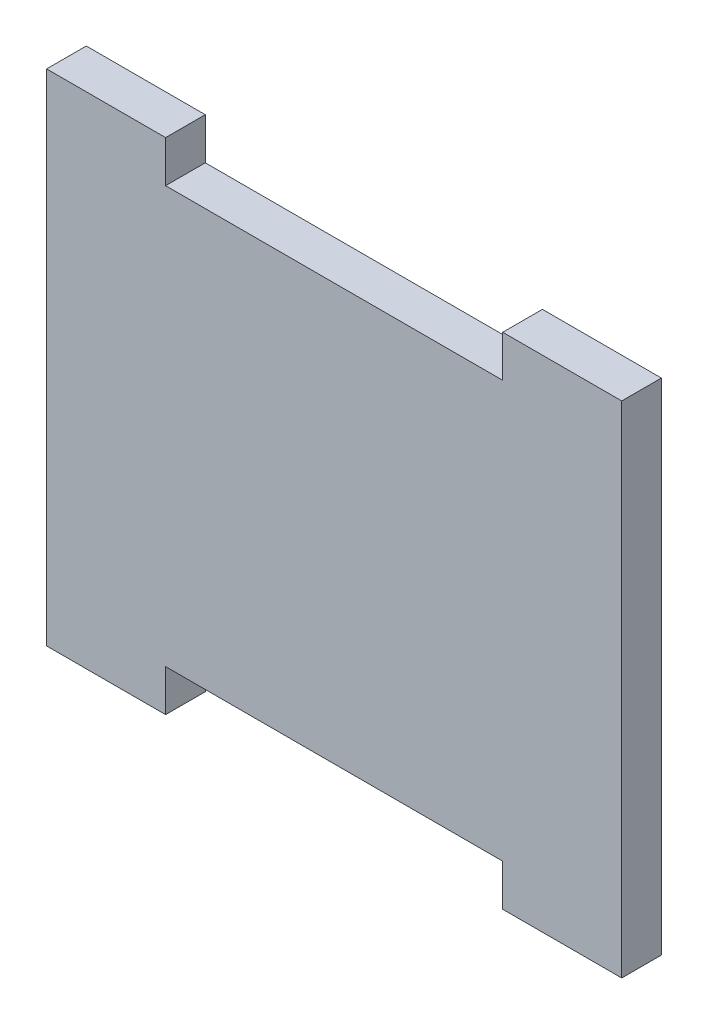
ISO-10303-21;
HEADER;
FILE_DESCRIPTION(('STEP AP214'),'2;1');
FILE_NAME('part.step','',(''),(''),'','','');
FILE_SCHEMA(('AUTOMOTIVE_DESIGN { 1 0 10303 214 1 1 1 1 }'));
ENDSEC;
DATA;
#1=APPLICATION_CONTEXT('core data for automotive mechanical design processes');
#2=APPLICATION_PROTOCOL_DEFINITION('international standard','automotive_design',2000,#1);
#3=PRODUCT_CONTEXT('',#1,'mechanical');
#4=PRODUCT('Part','Part','',(#3));
#5=PRODUCT_RELATED_PRODUCT_CATEGORY('part','',(#4));
#6=PRODUCT_DEFINITION_FORMATION('','',#4);
#7=PRODUCT_DEFINITION_CONTEXT('part definition',#1,'design');
#8=PRODUCT_DEFINITION('design','',#6,#7);
#9=PRODUCT_DEFINITION_SHAPE('','',#8);
#10=(LENGTH_UNIT() NAMED_UNIT(*) SI_UNIT(.MILLI.,.METRE.));
#11=(NAMED_UNIT(*) PLANE_ANGLE_UNIT() SI_UNIT($,.RADIAN.));
#12=(NAMED_UNIT(*) SI_UNIT($,.STERADIAN.) SOLID_ANGLE_UNIT());
#13=UNCERTAINTY_MEASURE_WITH_UNIT(LENGTH_MEASURE(1.E-05),#10,'distance_accuracy_value','');
#14=(GEOMETRIC_REPRESENTATION_CONTEXT(3) GLOBAL_UNCERTAINTY_ASSIGNED_CONTEXT((#13)) GLOBAL_UNIT_ASSIGNED_CONTEXT((#10,
#11,#12)) REPRESENTATION_CONTEXT('',''));
#15=CARTESIAN_POINT('',(0.,0.,0.));
#16=DIRECTION('',(0.,0.,1.));
#17=DIRECTION('',(1.,0.,0.));
#18=AXIS2_PLACEMENT_3D('',#15,#16,#17);
#19=CARTESIAN_POINT('',(0.,10.5,2.));
#20=DIRECTION('',(0.,-1.,0.));
#21=DIRECTION('',(1.,0.,0.));
#22=AXIS2_PLACEMENT_3D('',#19,#20,#21);
#23=PLANE('',#22);
#24=DIRECTION('',(-1.,0.,0.));
#25=VECTOR('',#24,1.);
#26=CARTESIAN_POINT('',(0.,10.5,0.));
#27=LINE('',#26,#25);
#28=CARTESIAN_POINT('',(-1.58229785331569,10.5,0.));
#29=VERTEX_POINT('',#28);
#30=CARTESIAN_POINT('',(-18.5822978533157,10.5,0.));
#31=VERTEX_POINT('',#30);
#32=EDGE_CURVE('E160',#29,#31,#27,.T.);
#33=ORIENTED_EDGE('',*,*,#32,.T.);
#34=DIRECTION('',(0.,0.,-1.));
#35=VECTOR('',#34,1.);
#36=CARTESIAN_POINT('',(-18.5822978533157,10.5,2.));
#37=LINE('',#36,#35);
#38=CARTESIAN_POINT('',(-18.5822978533157,10.5,2.));
#39=VERTEX_POINT('',#38);
#40=EDGE_CURVE('E11',#39,#31,#37,.T.);
#41=ORIENTED_EDGE('',*,*,#40,.F.);
#42=DIRECTION('',(-1.,0.,0.));
#43=VECTOR('',#42,1.);
#44=CARTESIAN_POINT('',(0.,10.5,2.));
#45=LINE('',#44,#43);
#46=CARTESIAN_POINT('',(-1.58229785331569,10.5,2.));
#47=VERTEX_POINT('',#46);
#48=EDGE_CURVE('E187',#47,#39,#45,.T.);
#49=ORIENTED_EDGE('',*,*,#48,.F.);
#50=DIRECTION('',(0.,0.,-1.));
#51=VECTOR('',#50,1.);
#52=CARTESIAN_POINT('',(-1.58229785331569,10.5,2.));
#53=LINE('',#52,#51);
#54=EDGE_CURVE('E55',#47,#29,#53,.T.);
#55=ORIENTED_EDGE('',*,*,#54,.T.);
#56=EDGE_LOOP('',(#33,#41,#49,#55));
#57=FACE_BOUND('',#56,.T.);
#58=ADVANCED_FACE('F39',(#57),#23,.F.);
#59=CARTESIAN_POINT('',(-18.5822978533157,0.,2.));
#60=DIRECTION('',(-1.,0.,0.));
#61=DIRECTION('',(0.,-1.,0.));
#62=AXIS2_PLACEMENT_3D('',#59,#60,#61);
#63=PLANE('',#62);
#64=DIRECTION('',(0.,1.,0.));
#65=VECTOR('',#64,1.);
#66=CARTESIAN_POINT('',(-18.5822978533157,0.,0.));
#67=LINE('',#66,#65);
#68=CARTESIAN_POINT('',(-18.5822978533157,12.6,0.));
#69=VERTEX_POINT('',#68);
#70=EDGE_CURVE('E162',#31,#69,#67,.T.);
#71=ORIENTED_EDGE('',*,*,#70,.T.);
#72=DIRECTION('',(0.,0.,-1.));
#73=VECTOR('',#72,1.);
#74=CARTESIAN_POINT('',(-18.5822978533157,12.6,2.));
#75=LINE('',#74,#73);
#76=CARTESIAN_POINT('',(-18.5822978533157,12.6,2.));
#77=VERTEX_POINT('',#76);
#78=EDGE_CURVE('E47',#77,#69,#75,.T.);
#79=ORIENTED_EDGE('',*,*,#78,.F.);
#80=DIRECTION('',(0.,1.,0.));
#81=VECTOR('',#80,1.);
#82=CARTESIAN_POINT('',(-18.5822978533157,0.,2.));
#83=LINE('',#82,#81);
#84=EDGE_CURVE('E105',#39,#77,#83,.T.);
#85=ORIENTED_EDGE('',*,*,#84,.F.);
#86=ORIENTED_EDGE('',*,*,#40,.T.);
#87=EDGE_LOOP('',(#71,#79,#85,#86));
#88=FACE_BOUND('',#87,.T.);
#89=ADVANCED_FACE('F257',(#88),#63,.F.);
#90=CARTESIAN_POINT('',(0.,12.6,2.));
#91=DIRECTION('',(0.,-1.,0.));
#92=DIRECTION('',(1.,0.,0.));
#93=AXIS2_PLACEMENT_3D('',#90,#91,#92);
#94=PLANE('',#93);
#95=DIRECTION('',(-1.,0.,0.));
#96=VECTOR('',#95,1.);
#97=CARTESIAN_POINT('',(0.,12.6,0.));
#98=LINE('',#97,#96);
#99=CARTESIAN_POINT('',(-24.5822978533157,12.6,0.));
#100=VERTEX_POINT('',#99);
#101=EDGE_CURVE('E164',#69,#100,#98,.T.);
#102=ORIENTED_EDGE('',*,*,#101,.T.);
#103=DIRECTION('',(0.,0.,-1.));
#104=VECTOR('',#103,1.);
#105=CARTESIAN_POINT('',(-24.5822978533157,12.6,2.));
#106=LINE('',#105,#104);
#107=CARTESIAN_POINT('',(-24.5822978533157,12.6,2.));
#108=VERTEX_POINT('',#107);
#109=EDGE_CURVE('E203',#108,#100,#106,.T.);
#110=ORIENTED_EDGE('',*,*,#109,.F.);
#111=DIRECTION('',(-1.,0.,0.));
#112=VECTOR('',#111,1.);
#113=CARTESIAN_POINT('',(0.,12.6,2.));
#114=LINE('',#113,#112);
#115=EDGE_CURVE('E211',#77,#108,#114,.T.);
#116=ORIENTED_EDGE('',*,*,#115,.F.);
#117=ORIENTED_EDGE('',*,*,#78,.T.);
#118=EDGE_LOOP('',(#102,#110,#116,#117));
#119=FACE_BOUND('',#118,.T.);
#120=ADVANCED_FACE('F209',(#119),#94,.F.);
#121=CARTESIAN_POINT('',(-24.5822978533157,0.,2.));
#122=DIRECTION('',(1.,0.,0.));
#123=DIRECTION('',(0.,0.,-1.));
#124=AXIS2_PLACEMENT_3D('',#121,#122,#123);
#125=PLANE('',#124);
#126=DIRECTION('',(0.,-1.,0.));
#127=VECTOR('',#126,1.);
#128=CARTESIAN_POINT('',(-24.5822978533157,0.,0.));
#129=LINE('',#128,#127);
#130=CARTESIAN_POINT('',(-24.5822978533157,-12.6,0.));
#131=VERTEX_POINT('',#130);
#132=EDGE_CURVE('E166',#100,#131,#129,.T.);
#133=ORIENTED_EDGE('',*,*,#132,.T.);
#134=DIRECTION('',(0.,0.,-1.));
#135=VECTOR('',#134,1.);
#136=CARTESIAN_POINT('',(-24.5822978533157,-12.6,2.));
#137=LINE('',#136,#135);
#138=CARTESIAN_POINT('',(-24.5822978533157,-12.6,2.));
#139=VERTEX_POINT('',#138);
#140=EDGE_CURVE('E201',#139,#131,#137,.T.);
#141=ORIENTED_EDGE('',*,*,#140,.F.);
#142=DIRECTION('',(0.,-1.,0.));
#143=VECTOR('',#142,1.);
#144=CARTESIAN_POINT('',(-24.5822978533157,0.,2.));
#145=LINE('',#144,#143);
#146=EDGE_CURVE('E221',#108,#139,#145,.T.);
#147=ORIENTED_EDGE('',*,*,#146,.F.);
#148=ORIENTED_EDGE('',*,*,#109,.T.);
#149=EDGE_LOOP('',(#133,#141,#147,#148));
#150=FACE_BOUND('',#149,.T.);
#151=ADVANCED_FACE('F218',(#150),#125,.F.);
#152=CARTESIAN_POINT('',(0.,-12.6,2.));
#153=DIRECTION('',(0.,-1.,0.));
#154=DIRECTION('',(1.,0.,0.));
#155=AXIS2_PLACEMENT_3D('',#152,#153,#154);
#156=PLANE('',#155);
#157=DIRECTION('',(-1.,0.,0.));
#158=VECTOR('',#157,1.);
#159=CARTESIAN_POINT('',(0.,-12.6,0.));
#160=LINE('',#159,#158);
#161=CARTESIAN_POINT('',(-18.5822978533157,-12.6,0.));
#162=VERTEX_POINT('',#161);
#163=EDGE_CURVE('E169',#162,#131,#160,.T.);
#164=ORIENTED_EDGE('',*,*,#163,.F.);
#165=DIRECTION('',(0.,0.,-1.));
#166=VECTOR('',#165,1.);
#167=CARTESIAN_POINT('',(-18.5822978533157,-12.6,2.));
#168=LINE('',#167,#166);
#169=CARTESIAN_POINT('',(-18.5822978533157,-12.6,2.));
#170=VERTEX_POINT('',#169);
#171=EDGE_CURVE('E199',#170,#162,#168,.T.);
#172=ORIENTED_EDGE('',*,*,#171,.F.);
#173=DIRECTION('',(-1.,0.,0.));
#174=VECTOR('',#173,1.);
#175=CARTESIAN_POINT('',(0.,-12.6,2.));
#176=LINE('',#175,#174);
#177=EDGE_CURVE('E223',#170,#139,#176,.T.);
#178=ORIENTED_EDGE('',*,*,#177,.T.);
#179=ORIENTED_EDGE('',*,*,#140,.T.);
#180=EDGE_LOOP('',(#164,#172,#178,#179));
#181=FACE_BOUND('',#180,.T.);
#182=ADVANCED_FACE('F270',(#181),#156,.T.);
#183=CARTESIAN_POINT('',(-18.5822978533157,0.,2.));
#184=DIRECTION('',(1.,0.,0.));
#185=DIRECTION('',(0.,1.,0.));
#186=AXIS2_PLACEMENT_3D('',#183,#184,#185);
#187=PLANE('',#186);
#188=DIRECTION('',(0.,-1.,0.));
#189=VECTOR('',#188,1.);
#190=CARTESIAN_POINT('',(-18.5822978533157,0.,0.));
#191=LINE('',#190,#189);
#192=CARTESIAN_POINT('',(-18.5822978533157,-10.5,0.));
#193=VERTEX_POINT('',#192);
#194=EDGE_CURVE('E172',#193,#162,#191,.T.);
#195=ORIENTED_EDGE('',*,*,#194,.F.);
#196=DIRECTION('',(0.,0.,-1.));
#197=VECTOR('',#196,1.);
#198=CARTESIAN_POINT('',(-18.5822978533157,-10.5,2.));
#199=LINE('',#198,#197);
#200=CARTESIAN_POINT('',(-18.5822978533157,-10.5,2.));
#201=VERTEX_POINT('',#200);
#202=EDGE_CURVE('E197',#201,#193,#199,.T.);
#203=ORIENTED_EDGE('',*,*,#202,.F.);
#204=DIRECTION('',(0.,-1.,0.));
#205=VECTOR('',#204,1.);
#206=CARTESIAN_POINT('',(-18.5822978533157,0.,2.));
#207=LINE('',#206,#205);
#208=EDGE_CURVE('E225',#201,#170,#207,.T.);
#209=ORIENTED_EDGE('',*,*,#208,.T.);
#210=ORIENTED_EDGE('',*,*,#171,.T.);
#211=EDGE_LOOP('',(#195,#203,#209,#210));
#212=FACE_BOUND('',#211,.T.);
#213=ADVANCED_FACE('F273',(#212),#187,.T.);
#214=CARTESIAN_POINT('',(0.,-10.5,2.));
#215=DIRECTION('',(0.,1.,0.));
#216=DIRECTION('',(0.,0.,1.));
#217=AXIS2_PLACEMENT_3D('',#214,#215,#216);
#218=PLANE('',#217);
#219=DIRECTION('',(1.,0.,0.));
#220=VECTOR('',#219,1.);
#221=CARTESIAN_POINT('',(0.,-10.5,0.));
#222=LINE('',#221,#220);
#223=CARTESIAN_POINT('',(-1.58229785331569,-10.5,0.));
#224=VERTEX_POINT('',#223);
#225=EDGE_CURVE('E175',#193,#224,#222,.T.);
#226=ORIENTED_EDGE('',*,*,#225,.T.);
#227=DIRECTION('',(0.,0.,-1.));
#228=VECTOR('',#227,1.);
#229=CARTESIAN_POINT('',(-1.58229785331569,-10.5,2.));
#230=LINE('',#229,#228);
#231=CARTESIAN_POINT('',(-1.58229785331569,-10.5,2.));
#232=VERTEX_POINT('',#231);
#233=EDGE_CURVE('E194',#232,#224,#230,.T.);
#234=ORIENTED_EDGE('',*,*,#233,.F.);
#235=DIRECTION('',(1.,0.,0.));
#236=VECTOR('',#235,1.);
#237=CARTESIAN_POINT('',(0.,-10.5,2.));
#238=LINE('',#237,#236);
#239=EDGE_CURVE('E232',#201,#232,#238,.T.);
#240=ORIENTED_EDGE('',*,*,#239,.F.);
#241=ORIENTED_EDGE('',*,*,#202,.T.);
#242=EDGE_LOOP('',(#226,#234,#240,#241));
#243=FACE_BOUND('',#242,.T.);
#244=ADVANCED_FACE('F277',(#243),#218,.F.);
#245=CARTESIAN_POINT('',(-1.58229785331569,0.,2.));
#246=DIRECTION('',(1.,0.,0.));
#247=DIRECTION('',(0.,1.,0.));
#248=AXIS2_PLACEMENT_3D('',#245,#246,#247);
#249=PLANE('',#248);
#250=DIRECTION('',(0.,-1.,0.));
#251=VECTOR('',#250,1.);
#252=CARTESIAN_POINT('',(-1.58229785331569,0.,0.));
#253=LINE('',#252,#251);
#254=CARTESIAN_POINT('',(-1.58229785331569,-12.6,0.));
#255=VERTEX_POINT('',#254);
#256=EDGE_CURVE('E177',#224,#255,#253,.T.);
#257=ORIENTED_EDGE('',*,*,#256,.T.);
#258=DIRECTION('',(0.,0.,-1.));
#259=VECTOR('',#258,1.);
#260=CARTESIAN_POINT('',(-1.58229785331569,-12.6,2.));
#261=LINE('',#260,#259);
#262=CARTESIAN_POINT('',(-1.58229785331569,-12.6,2.));
#263=VERTEX_POINT('',#262);
#264=EDGE_CURVE('E191',#263,#255,#261,.T.);
#265=ORIENTED_EDGE('',*,*,#264,.F.);
#266=DIRECTION('',(0.,-1.,0.));
#267=VECTOR('',#266,1.);
#268=CARTESIAN_POINT('',(-1.58229785331569,0.,2.));
#269=LINE('',#268,#267);
#270=EDGE_CURVE('E234',#232,#263,#269,.T.);
#271=ORIENTED_EDGE('',*,*,#270,.F.);
#272=ORIENTED_EDGE('',*,*,#233,.T.);
#273=EDGE_LOOP('',(#257,#265,#271,#272));
#274=FACE_BOUND('',#273,.T.);
#275=ADVANCED_FACE('F241',(#274),#249,.F.);
#276=CARTESIAN_POINT('',(0.,-12.6,2.));
#277=DIRECTION('',(0.,1.,0.));
#278=DIRECTION('',(0.,0.,1.));
#279=AXIS2_PLACEMENT_3D('',#276,#277,#278);
#280=PLANE('',#279);
#281=DIRECTION('',(1.,0.,0.));
#282=VECTOR('',#281,1.);
#283=CARTESIAN_POINT('',(0.,-12.6,0.));
#284=LINE('',#283,#282);
#285=CARTESIAN_POINT('',(4.41770214668431,-12.6,0.));
#286=VERTEX_POINT('',#285);
#287=EDGE_CURVE('E179',#255,#286,#284,.T.);
#288=ORIENTED_EDGE('',*,*,#287,.T.);
#289=DIRECTION('',(0.,0.,-1.));
#290=VECTOR('',#289,1.);
#291=CARTESIAN_POINT('',(4.41770214668431,-12.6,2.));
#292=LINE('',#291,#290);
#293=CARTESIAN_POINT('',(4.41770214668431,-12.6,2.));
#294=VERTEX_POINT('',#293);
#295=EDGE_CURVE('E152',#294,#286,#292,.T.);
#296=ORIENTED_EDGE('',*,*,#295,.F.);
#297=DIRECTION('',(1.,0.,0.));
#298=VECTOR('',#297,1.);
#299=CARTESIAN_POINT('',(0.,-12.6,2.));
#300=LINE('',#299,#298);
#301=EDGE_CURVE('E140',#263,#294,#300,.T.);
#302=ORIENTED_EDGE('',*,*,#301,.F.);
#303=ORIENTED_EDGE('',*,*,#264,.T.);
#304=EDGE_LOOP('',(#288,#296,#302,#303));
#305=FACE_BOUND('',#304,.T.);
#306=ADVANCED_FACE('F245',(#305),#280,.F.);
#307=CARTESIAN_POINT('',(4.41770214668431,0.,2.));
#308=DIRECTION('',(-1.,0.,0.));
#309=DIRECTION('',(0.,0.,1.));
#310=AXIS2_PLACEMENT_3D('',#307,#308,#309);
#311=PLANE('',#310);
#312=DIRECTION('',(0.,1.,0.));
#313=VECTOR('',#312,1.);
#314=CARTESIAN_POINT('',(4.41770214668431,0.,0.));
#315=LINE('',#314,#313);
#316=CARTESIAN_POINT('',(4.41770214668431,12.6,0.));
#317=VERTEX_POINT('',#316);
#318=EDGE_CURVE('E149',#286,#317,#315,.T.);
#319=ORIENTED_EDGE('',*,*,#318,.T.);
#320=DIRECTION('',(0.,0.,-1.));
#321=VECTOR('',#320,1.);
#322=CARTESIAN_POINT('',(4.41770214668431,12.6,2.));
#323=LINE('',#322,#321);
#324=CARTESIAN_POINT('',(4.41770214668431,12.6,2.));
#325=VERTEX_POINT('',#324);
#326=EDGE_CURVE('E146',#325,#317,#323,.T.);
#327=ORIENTED_EDGE('',*,*,#326,.F.);
#328=DIRECTION('',(0.,1.,0.));
#329=VECTOR('',#328,1.);
#330=CARTESIAN_POINT('',(4.41770214668431,0.,2.));
#331=LINE('',#330,#329);
#332=EDGE_CURVE('E133',#294,#325,#331,.T.);
#333=ORIENTED_EDGE('',*,*,#332,.F.);
#334=ORIENTED_EDGE('',*,*,#295,.T.);
#335=EDGE_LOOP('',(#319,#327,#333,#334));
#336=FACE_BOUND('',#335,.T.);
#337=ADVANCED_FACE('F147',(#336),#311,.F.);
#338=CARTESIAN_POINT('',(0.,12.6,2.));
#339=DIRECTION('',(0.,1.,0.));
#340=DIRECTION('',(0.,0.,1.));
#341=AXIS2_PLACEMENT_3D('',#338,#339,#340);
#342=PLANE('',#341);
#343=DIRECTION('',(1.,0.,0.));
#344=VECTOR('',#343,1.);
#345=CARTESIAN_POINT('',(0.,12.6,0.));
#346=LINE('',#345,#344);
#347=CARTESIAN_POINT('',(-1.58229785331569,12.6,0.));
#348=VERTEX_POINT('',#347);
#349=EDGE_CURVE('E182',#348,#317,#346,.T.);
#350=ORIENTED_EDGE('',*,*,#349,.F.);
#351=DIRECTION('',(0.,0.,-1.));
#352=VECTOR('',#351,1.);
#353=CARTESIAN_POINT('',(-1.58229785331569,12.6,2.));
#354=LINE('',#353,#352);
#355=CARTESIAN_POINT('',(-1.58229785331569,12.6,2.));
#356=VERTEX_POINT('',#355);
#357=EDGE_CURVE('E93',#356,#348,#354,.T.);
#358=ORIENTED_EDGE('',*,*,#357,.F.);
#359=DIRECTION('',(1.,0.,0.));
#360=VECTOR('',#359,1.);
#361=CARTESIAN_POINT('',(0.,12.6,2.));
#362=LINE('',#361,#360);
#363=EDGE_CURVE('E138',#356,#325,#362,.T.);
#364=ORIENTED_EDGE('',*,*,#363,.T.);
#365=ORIENTED_EDGE('',*,*,#326,.T.);
#366=EDGE_LOOP('',(#350,#358,#364,#365));
#367=FACE_BOUND('',#366,.T.);
#368=ADVANCED_FACE('F154',(#367),#342,.T.);
#369=CARTESIAN_POINT('',(-1.58229785331569,0.,2.));
#370=DIRECTION('',(-1.,0.,0.));
#371=DIRECTION('',(0.,-1.,0.));
#372=AXIS2_PLACEMENT_3D('',#369,#370,#371);
#373=PLANE('',#372);
#374=DIRECTION('',(0.,1.,0.));
#375=VECTOR('',#374,1.);
#376=CARTESIAN_POINT('',(-1.58229785331569,0.,0.));
#377=LINE('',#376,#375);
#378=EDGE_CURVE('E184',#29,#348,#377,.T.);
#379=ORIENTED_EDGE('',*,*,#378,.F.);
#380=ORIENTED_EDGE('',*,*,#54,.F.);
#381=DIRECTION('',(0.,1.,0.));
#382=VECTOR('',#381,1.);
#383=CARTESIAN_POINT('',(-1.58229785331569,0.,2.));
#384=LINE('',#383,#382);
#385=EDGE_CURVE('E155',#47,#356,#384,.T.);
#386=ORIENTED_EDGE('',*,*,#385,.T.);
#387=ORIENTED_EDGE('',*,*,#357,.T.);
#388=EDGE_LOOP('',(#379,#380,#386,#387));
#389=FACE_BOUND('',#388,.T.);
#390=ADVANCED_FACE('F246',(#389),#373,.T.);
#391=CARTESIAN_POINT('',(0.,0.,2.));
#392=DIRECTION('',(0.,0.,1.));
#393=DIRECTION('',(1.,0.,0.));
#394=AXIS2_PLACEMENT_3D('',#391,#392,#393);
#395=PLANE('',#394);
#396=ORIENTED_EDGE('',*,*,#48,.T.);
#397=ORIENTED_EDGE('',*,*,#84,.T.);
#398=ORIENTED_EDGE('',*,*,#115,.T.);
#399=ORIENTED_EDGE('',*,*,#146,.T.);
#400=ORIENTED_EDGE('',*,*,#177,.F.);
#401=ORIENTED_EDGE('',*,*,#208,.F.);
#402=ORIENTED_EDGE('',*,*,#239,.T.);
#403=ORIENTED_EDGE('',*,*,#270,.T.);
#404=ORIENTED_EDGE('',*,*,#301,.T.);
#405=ORIENTED_EDGE('',*,*,#332,.T.);
#406=ORIENTED_EDGE('',*,*,#363,.F.);
#407=ORIENTED_EDGE('',*,*,#385,.F.);
#408=EDGE_LOOP('',(#396,#397,#398,#399,#400,#401,#402,#403,#404,#405,#406,#407));
#409=FACE_BOUND('',#408,.T.);
#410=ADVANCED_FACE('F135',(#409),#395,.T.);
#411=CARTESIAN_POINT('',(0.,0.,0.));
#412=DIRECTION('',(0.,0.,1.));
#413=DIRECTION('',(1.,0.,0.));
#414=AXIS2_PLACEMENT_3D('',#411,#412,#413);
#415=PLANE('',#414);
#416=ORIENTED_EDGE('',*,*,#32,.F.);
#417=ORIENTED_EDGE('',*,*,#378,.T.);
#418=ORIENTED_EDGE('',*,*,#349,.T.);
#419=ORIENTED_EDGE('',*,*,#318,.F.);
#420=ORIENTED_EDGE('',*,*,#287,.F.);
#421=ORIENTED_EDGE('',*,*,#256,.F.);
#422=ORIENTED_EDGE('',*,*,#225,.F.);
#423=ORIENTED_EDGE('',*,*,#194,.T.);
#424=ORIENTED_EDGE('',*,*,#163,.T.);
#425=ORIENTED_EDGE('',*,*,#132,.F.);
#426=ORIENTED_EDGE('',*,*,#101,.F.);
#427=ORIENTED_EDGE('',*,*,#70,.F.);
#428=EDGE_LOOP('',(#416,#417,#418,#419,#420,#421,#422,#423,#424,#425,#426,#427));
#429=FACE_BOUND('',#428,.T.);
#430=ADVANCED_FACE('F214',(#429),#415,.F.);
#431=CLOSED_SHELL('',(#58,#89,#120,#151,#182,#213,#244,#275,#306,#337,#368,#390,#410,#430));
#432=MANIFOLD_SOLID_BREP('B2',#431);
#433=ADVANCED_BREP_SHAPE_REPRESENTATION('',(#18,#432),#14);
#434=SHAPE_DEFINITION_REPRESENTATION(#9,#433);
ENDSEC;
END-ISO-10303-21;
